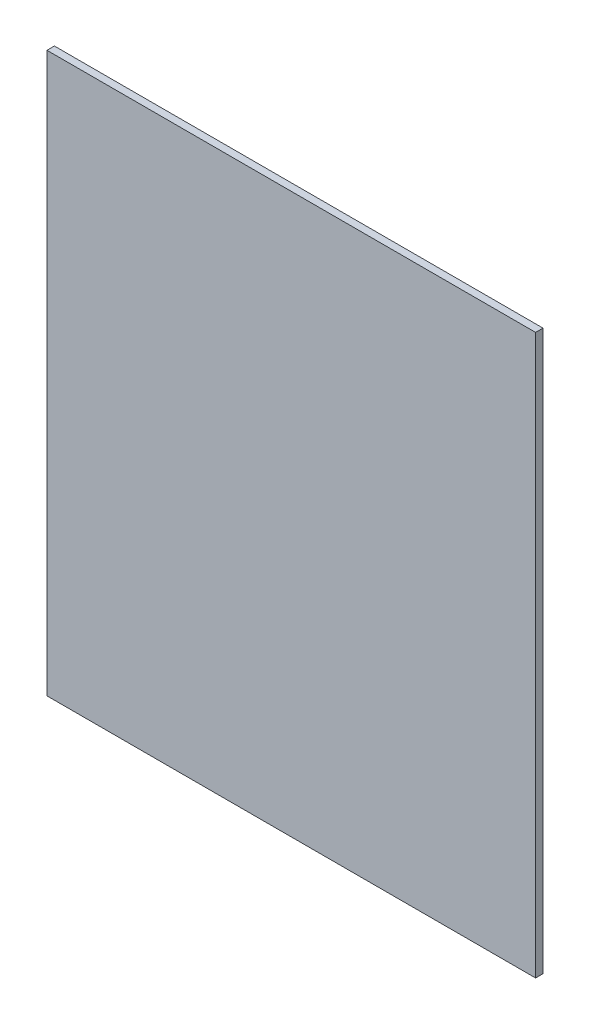
ISO-10303-21;
HEADER;
FILE_DESCRIPTION(('STEP AP214'),'2;1');
FILE_NAME('part.step','',(''),(''),'','','');
FILE_SCHEMA(('AUTOMOTIVE_DESIGN { 1 0 10303 214 1 1 1 1 }'));
ENDSEC;
DATA;
#1=APPLICATION_CONTEXT('core data for automotive mechanical design processes');
#2=APPLICATION_PROTOCOL_DEFINITION('international standard','automotive_design',2000,#1);
#3=PRODUCT_CONTEXT('',#1,'mechanical');
#4=PRODUCT('Part','Part','',(#3));
#5=PRODUCT_RELATED_PRODUCT_CATEGORY('part','',(#4));
#6=PRODUCT_DEFINITION_FORMATION('','',#4);
#7=PRODUCT_DEFINITION_CONTEXT('part definition',#1,'design');
#8=PRODUCT_DEFINITION('design','',#6,#7);
#9=PRODUCT_DEFINITION_SHAPE('','',#8);
#10=(LENGTH_UNIT() NAMED_UNIT(*) SI_UNIT(.MILLI.,.METRE.));
#11=(NAMED_UNIT(*) PLANE_ANGLE_UNIT() SI_UNIT($,.RADIAN.));
#12=(NAMED_UNIT(*) SI_UNIT($,.STERADIAN.) SOLID_ANGLE_UNIT());
#13=UNCERTAINTY_MEASURE_WITH_UNIT(LENGTH_MEASURE(1.E-05),#10,'distance_accuracy_value','');
#14=(GEOMETRIC_REPRESENTATION_CONTEXT(3) GLOBAL_UNCERTAINTY_ASSIGNED_CONTEXT((#13)) GLOBAL_UNIT_ASSIGNED_CONTEXT((#10,
#11,#12)) REPRESENTATION_CONTEXT('',''));
#15=CARTESIAN_POINT('',(0.,0.,0.));
#16=DIRECTION('',(0.,0.,1.));
#17=DIRECTION('',(1.,0.,0.));
#18=AXIS2_PLACEMENT_3D('',#15,#16,#17);
#19=CARTESIAN_POINT('',(987.633917072173,718.8021575728,0.));
#20=DIRECTION('',(0.,0.,1.));
#21=DIRECTION('',(1.,0.,0.));
#22=AXIS2_PLACEMENT_3D('',#19,#20,#21);
#23=PLANE('',#22);
#24=DIRECTION('',(0.,-1.,0.));
#25=VECTOR('',#24,1.);
#26=CARTESIAN_POINT('',(360.133917072173,1436.8021575728,0.));
#27=LINE('',#26,#25);
#28=CARTESIAN_POINT('',(360.133917072173,1436.8021575728,0.));
#29=VERTEX_POINT('',#28);
#30=CARTESIAN_POINT('',(360.133917072173,0.802157572800297,0.));
#31=VERTEX_POINT('',#30);
#32=EDGE_CURVE('E30',#29,#31,#27,.T.);
#33=ORIENTED_EDGE('',*,*,#32,.F.);
#34=DIRECTION('',(-1.,0.,0.));
#35=VECTOR('',#34,1.);
#36=CARTESIAN_POINT('',(1615.13391707217,1436.8021575728,0.));
#37=LINE('',#36,#35);
#38=CARTESIAN_POINT('',(1615.13391707217,1436.8021575728,0.));
#39=VERTEX_POINT('',#38);
#40=EDGE_CURVE('E108',#39,#29,#37,.T.);
#41=ORIENTED_EDGE('',*,*,#40,.F.);
#42=DIRECTION('',(0.,1.,0.));
#43=VECTOR('',#42,1.);
#44=CARTESIAN_POINT('',(1615.13391707217,0.802157572800297,0.));
#45=LINE('',#44,#43);
#46=CARTESIAN_POINT('',(1615.13391707217,0.802157572800297,0.));
#47=VERTEX_POINT('',#46);
#48=EDGE_CURVE('E88',#47,#39,#45,.T.);
#49=ORIENTED_EDGE('',*,*,#48,.F.);
#50=DIRECTION('',(1.,0.,0.));
#51=VECTOR('',#50,1.);
#52=CARTESIAN_POINT('',(360.133917072173,0.802157572800297,0.));
#53=LINE('',#52,#51);
#54=EDGE_CURVE('E75',#31,#47,#53,.T.);
#55=ORIENTED_EDGE('',*,*,#54,.F.);
#56=EDGE_LOOP('',(#33,#41,#49,#55));
#57=FACE_BOUND('',#56,.T.);
#58=ADVANCED_FACE('F17',(#57),#23,.F.);
#59=CARTESIAN_POINT('',(987.633917072173,718.8021575728,19.05));
#60=DIRECTION('',(0.,0.,1.));
#61=DIRECTION('',(1.,0.,0.));
#62=AXIS2_PLACEMENT_3D('',#59,#60,#61);
#63=PLANE('',#62);
#64=DIRECTION('',(0.,-1.,0.));
#65=VECTOR('',#64,1.);
#66=CARTESIAN_POINT('',(360.133917072173,1436.8021575728,19.05));
#67=LINE('',#66,#65);
#68=CARTESIAN_POINT('',(360.133917072173,1436.8021575728,19.05));
#69=VERTEX_POINT('',#68);
#70=CARTESIAN_POINT('',(360.133917072173,0.802157572800297,19.05));
#71=VERTEX_POINT('',#70);
#72=EDGE_CURVE('E11',#69,#71,#67,.T.);
#73=ORIENTED_EDGE('',*,*,#72,.T.);
#74=DIRECTION('',(1.,0.,0.));
#75=VECTOR('',#74,1.);
#76=CARTESIAN_POINT('',(360.133917072173,0.802157572800297,19.05));
#77=LINE('',#76,#75);
#78=CARTESIAN_POINT('',(1615.13391707217,0.802157572800297,19.05));
#79=VERTEX_POINT('',#78);
#80=EDGE_CURVE('E20',#71,#79,#77,.T.);
#81=ORIENTED_EDGE('',*,*,#80,.T.);
#82=DIRECTION('',(0.,1.,0.));
#83=VECTOR('',#82,1.);
#84=CARTESIAN_POINT('',(1615.13391707217,0.802157572800297,19.05));
#85=LINE('',#84,#83);
#86=CARTESIAN_POINT('',(1615.13391707217,1436.8021575728,19.05));
#87=VERTEX_POINT('',#86);
#88=EDGE_CURVE('E65',#79,#87,#85,.T.);
#89=ORIENTED_EDGE('',*,*,#88,.T.);
#90=DIRECTION('',(-1.,0.,0.));
#91=VECTOR('',#90,1.);
#92=CARTESIAN_POINT('',(1615.13391707217,1436.8021575728,19.05));
#93=LINE('',#92,#91);
#94=EDGE_CURVE('E115',#87,#69,#93,.T.);
#95=ORIENTED_EDGE('',*,*,#94,.T.);
#96=EDGE_LOOP('',(#73,#81,#89,#95));
#97=FACE_BOUND('',#96,.T.);
#98=ADVANCED_FACE('F64',(#97),#63,.T.);
#99=CARTESIAN_POINT('',(360.133917072173,1436.8021575728,0.));
#100=DIRECTION('',(-1.,0.,0.));
#101=DIRECTION('',(0.,0.,1.));
#102=AXIS2_PLACEMENT_3D('',#99,#100,#101);
#103=PLANE('',#102);
#104=ORIENTED_EDGE('',*,*,#32,.T.);
#105=DIRECTION('',(0.,0.,1.));
#106=VECTOR('',#105,1.);
#107=CARTESIAN_POINT('',(360.133917072173,0.802157572800297,0.));
#108=LINE('',#107,#106);
#109=EDGE_CURVE('E69',#31,#71,#108,.T.);
#110=ORIENTED_EDGE('',*,*,#109,.T.);
#111=ORIENTED_EDGE('',*,*,#72,.F.);
#112=DIRECTION('',(0.,0.,1.));
#113=VECTOR('',#112,1.);
#114=CARTESIAN_POINT('',(360.133917072173,1436.8021575728,0.));
#115=LINE('',#114,#113);
#116=EDGE_CURVE('E104',#29,#69,#115,.T.);
#117=ORIENTED_EDGE('',*,*,#116,.F.);
#118=EDGE_LOOP('',(#104,#110,#111,#117));
#119=FACE_BOUND('',#118,.T.);
#120=ADVANCED_FACE('F103',(#119),#103,.T.);
#121=CARTESIAN_POINT('',(360.133917072173,0.802157572800297,0.));
#122=DIRECTION('',(0.,-1.,0.));
#123=DIRECTION('',(0.,0.,-1.));
#124=AXIS2_PLACEMENT_3D('',#121,#122,#123);
#125=PLANE('',#124);
#126=ORIENTED_EDGE('',*,*,#54,.T.);
#127=DIRECTION('',(0.,0.,1.));
#128=VECTOR('',#127,1.);
#129=CARTESIAN_POINT('',(1615.13391707217,0.802157572800297,0.));
#130=LINE('',#129,#128);
#131=EDGE_CURVE('E73',#47,#79,#130,.T.);
#132=ORIENTED_EDGE('',*,*,#131,.T.);
#133=ORIENTED_EDGE('',*,*,#80,.F.);
#134=ORIENTED_EDGE('',*,*,#109,.F.);
#135=EDGE_LOOP('',(#126,#132,#133,#134));
#136=FACE_BOUND('',#135,.T.);
#137=ADVANCED_FACE('F72',(#136),#125,.T.);
#138=CARTESIAN_POINT('',(1615.13391707217,0.802157572800297,0.));
#139=DIRECTION('',(1.,0.,0.));
#140=DIRECTION('',(0.,1.,0.));
#141=AXIS2_PLACEMENT_3D('',#138,#139,#140);
#142=PLANE('',#141);
#143=ORIENTED_EDGE('',*,*,#48,.T.);
#144=DIRECTION('',(0.,0.,1.));
#145=VECTOR('',#144,1.);
#146=CARTESIAN_POINT('',(1615.13391707217,1436.8021575728,0.));
#147=LINE('',#146,#145);
#148=EDGE_CURVE('E83',#39,#87,#147,.T.);
#149=ORIENTED_EDGE('',*,*,#148,.T.);
#150=ORIENTED_EDGE('',*,*,#88,.F.);
#151=ORIENTED_EDGE('',*,*,#131,.F.);
#152=EDGE_LOOP('',(#143,#149,#150,#151));
#153=FACE_BOUND('',#152,.T.);
#154=ADVANCED_FACE('F81',(#153),#142,.T.);
#155=CARTESIAN_POINT('',(1615.13391707217,1436.8021575728,0.));
#156=DIRECTION('',(0.,1.,0.));
#157=DIRECTION('',(1.,0.,0.));
#158=AXIS2_PLACEMENT_3D('',#155,#156,#157);
#159=PLANE('',#158);
#160=ORIENTED_EDGE('',*,*,#40,.T.);
#161=ORIENTED_EDGE('',*,*,#116,.T.);
#162=ORIENTED_EDGE('',*,*,#94,.F.);
#163=ORIENTED_EDGE('',*,*,#148,.F.);
#164=EDGE_LOOP('',(#160,#161,#162,#163));
#165=FACE_BOUND('',#164,.T.);
#166=ADVANCED_FACE('F112',(#165),#159,.T.);
#167=CLOSED_SHELL('',(#58,#98,#120,#137,#154,#166));
#168=MANIFOLD_SOLID_BREP('B1',#167);
#169=ADVANCED_BREP_SHAPE_REPRESENTATION('',(#18,#168),#14);
#170=SHAPE_DEFINITION_REPRESENTATION(#9,#169);
ENDSEC;
END-ISO-10303-21;
